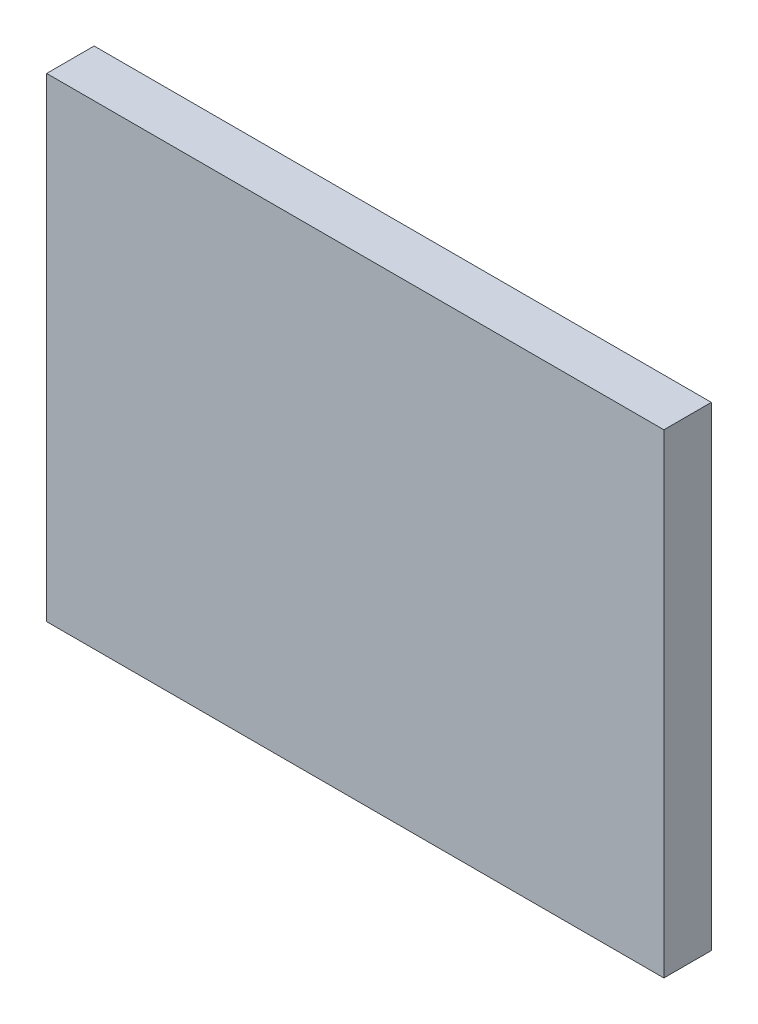
ISO-10303-21;
HEADER;
FILE_DESCRIPTION(('STEP AP214'),'2;1');
FILE_NAME('part.step','',(''),(''),'','','');
FILE_SCHEMA(('AUTOMOTIVE_DESIGN { 1 0 10303 214 1 1 1 1 }'));
ENDSEC;
DATA;
#1=APPLICATION_CONTEXT('core data for automotive mechanical design processes');
#2=APPLICATION_PROTOCOL_DEFINITION('international standard','automotive_design',2000,#1);
#3=PRODUCT_CONTEXT('',#1,'mechanical');
#4=PRODUCT('Part','Part','',(#3));
#5=PRODUCT_RELATED_PRODUCT_CATEGORY('part','',(#4));
#6=PRODUCT_DEFINITION_FORMATION('','',#4);
#7=PRODUCT_DEFINITION_CONTEXT('part definition',#1,'design');
#8=PRODUCT_DEFINITION('design','',#6,#7);
#9=PRODUCT_DEFINITION_SHAPE('','',#8);
#10=(LENGTH_UNIT() NAMED_UNIT(*) SI_UNIT(.MILLI.,.METRE.));
#11=(NAMED_UNIT(*) PLANE_ANGLE_UNIT() SI_UNIT($,.RADIAN.));
#12=(NAMED_UNIT(*) SI_UNIT($,.STERADIAN.) SOLID_ANGLE_UNIT());
#13=UNCERTAINTY_MEASURE_WITH_UNIT(LENGTH_MEASURE(1.E-05),#10,'distance_accuracy_value','');
#14=(GEOMETRIC_REPRESENTATION_CONTEXT(3) GLOBAL_UNCERTAINTY_ASSIGNED_CONTEXT((#13)) GLOBAL_UNIT_ASSIGNED_CONTEXT((#10,
#11,#12)) REPRESENTATION_CONTEXT('',''));
#15=CARTESIAN_POINT('',(0.,0.,0.));
#16=DIRECTION('',(0.,0.,1.));
#17=DIRECTION('',(1.,0.,0.));
#18=AXIS2_PLACEMENT_3D('',#15,#16,#17);
#19=CARTESIAN_POINT('',(-88.4513343349985,100.,10.));
#20=DIRECTION('',(1.,0.,0.));
#21=DIRECTION('',(0.,0.,-1.));
#22=AXIS2_PLACEMENT_3D('',#19,#20,#21);
#23=PLANE('',#22);
#24=DIRECTION('',(0.,-1.,0.));
#25=VECTOR('',#24,1.);
#26=CARTESIAN_POINT('',(-88.4513343349985,100.,0.));
#27=LINE('',#26,#25);
#28=CARTESIAN_POINT('',(-88.4513343349985,100.,0.));
#29=VERTEX_POINT('',#28);
#30=CARTESIAN_POINT('',(-88.4513343349985,0.,0.));
#31=VERTEX_POINT('',#30);
#32=EDGE_CURVE('E96',#29,#31,#27,.T.);
#33=ORIENTED_EDGE('',*,*,#32,.T.);
#34=DIRECTION('',(0.,0.,-1.));
#35=VECTOR('',#34,1.);
#36=CARTESIAN_POINT('',(-88.4513343349985,0.,10.));
#37=LINE('',#36,#35);
#38=CARTESIAN_POINT('',(-88.4513343349985,0.,10.));
#39=VERTEX_POINT('',#38);
#40=EDGE_CURVE('E11',#39,#31,#37,.T.);
#41=ORIENTED_EDGE('',*,*,#40,.F.);
#42=DIRECTION('',(0.,-1.,0.));
#43=VECTOR('',#42,1.);
#44=CARTESIAN_POINT('',(-88.4513343349985,100.,10.));
#45=LINE('',#44,#43);
#46=CARTESIAN_POINT('',(-88.4513343349985,100.,10.));
#47=VERTEX_POINT('',#46);
#48=EDGE_CURVE('E84',#47,#39,#45,.T.);
#49=ORIENTED_EDGE('',*,*,#48,.F.);
#50=DIRECTION('',(0.,0.,-1.));
#51=VECTOR('',#50,1.);
#52=CARTESIAN_POINT('',(-88.4513343349985,100.,10.));
#53=LINE('',#52,#51);
#54=EDGE_CURVE('E92',#47,#29,#53,.T.);
#55=ORIENTED_EDGE('',*,*,#54,.T.);
#56=EDGE_LOOP('',(#33,#41,#49,#55));
#57=FACE_BOUND('',#56,.T.);
#58=ADVANCED_FACE('F33',(#57),#23,.F.);
#59=CARTESIAN_POINT('',(-88.4513343349985,0.,10.));
#60=DIRECTION('',(0.,1.,0.));
#61=DIRECTION('',(0.,0.,1.));
#62=AXIS2_PLACEMENT_3D('',#59,#60,#61);
#63=PLANE('',#62);
#64=DIRECTION('',(1.,0.,0.));
#65=VECTOR('',#64,1.);
#66=CARTESIAN_POINT('',(-88.4513343349985,0.,0.));
#67=LINE('',#66,#65);
#68=CARTESIAN_POINT('',(41.5486656650015,0.,0.));
#69=VERTEX_POINT('',#68);
#70=EDGE_CURVE('E88',#31,#69,#67,.T.);
#71=ORIENTED_EDGE('',*,*,#70,.T.);
#72=DIRECTION('',(0.,0.,-1.));
#73=VECTOR('',#72,1.);
#74=CARTESIAN_POINT('',(41.5486656650015,0.,10.));
#75=LINE('',#74,#73);
#76=CARTESIAN_POINT('',(41.5486656650015,0.,10.));
#77=VERTEX_POINT('',#76);
#78=EDGE_CURVE('E41',#77,#69,#75,.T.);
#79=ORIENTED_EDGE('',*,*,#78,.F.);
#80=DIRECTION('',(1.,0.,0.));
#81=VECTOR('',#80,1.);
#82=CARTESIAN_POINT('',(-88.4513343349985,0.,10.));
#83=LINE('',#82,#81);
#84=EDGE_CURVE('E79',#39,#77,#83,.T.);
#85=ORIENTED_EDGE('',*,*,#84,.F.);
#86=ORIENTED_EDGE('',*,*,#40,.T.);
#87=EDGE_LOOP('',(#71,#79,#85,#86));
#88=FACE_BOUND('',#87,.T.);
#89=ADVANCED_FACE('F87',(#88),#63,.F.);
#90=CARTESIAN_POINT('',(41.5486656650015,0.,10.));
#91=DIRECTION('',(-1.,0.,0.));
#92=DIRECTION('',(0.,-1.,0.));
#93=AXIS2_PLACEMENT_3D('',#90,#91,#92);
#94=PLANE('',#93);
#95=DIRECTION('',(0.,1.,0.));
#96=VECTOR('',#95,1.);
#97=CARTESIAN_POINT('',(41.5486656650015,0.,0.));
#98=LINE('',#97,#96);
#99=CARTESIAN_POINT('',(41.5486656650015,100.,0.));
#100=VERTEX_POINT('',#99);
#101=EDGE_CURVE('E66',#69,#100,#98,.T.);
#102=ORIENTED_EDGE('',*,*,#101,.T.);
#103=DIRECTION('',(0.,0.,-1.));
#104=VECTOR('',#103,1.);
#105=CARTESIAN_POINT('',(41.5486656650015,100.,10.));
#106=LINE('',#105,#104);
#107=CARTESIAN_POINT('',(41.5486656650015,100.,10.));
#108=VERTEX_POINT('',#107);
#109=EDGE_CURVE('E89',#108,#100,#106,.T.);
#110=ORIENTED_EDGE('',*,*,#109,.F.);
#111=DIRECTION('',(0.,1.,0.));
#112=VECTOR('',#111,1.);
#113=CARTESIAN_POINT('',(41.5486656650015,0.,10.));
#114=LINE('',#113,#112);
#115=EDGE_CURVE('E82',#77,#108,#114,.T.);
#116=ORIENTED_EDGE('',*,*,#115,.F.);
#117=ORIENTED_EDGE('',*,*,#78,.T.);
#118=EDGE_LOOP('',(#102,#110,#116,#117));
#119=FACE_BOUND('',#118,.T.);
#120=ADVANCED_FACE('F90',(#119),#94,.F.);
#121=CARTESIAN_POINT('',(41.5486656650015,100.,10.));
#122=DIRECTION('',(0.,-1.,0.));
#123=DIRECTION('',(1.,0.,0.));
#124=AXIS2_PLACEMENT_3D('',#121,#122,#123);
#125=PLANE('',#124);
#126=DIRECTION('',(-1.,0.,0.));
#127=VECTOR('',#126,1.);
#128=CARTESIAN_POINT('',(41.5486656650015,100.,0.));
#129=LINE('',#128,#127);
#130=EDGE_CURVE('E72',#100,#29,#129,.T.);
#131=ORIENTED_EDGE('',*,*,#130,.T.);
#132=ORIENTED_EDGE('',*,*,#54,.F.);
#133=DIRECTION('',(-1.,0.,0.));
#134=VECTOR('',#133,1.);
#135=CARTESIAN_POINT('',(41.5486656650015,100.,10.));
#136=LINE('',#135,#134);
#137=EDGE_CURVE('E49',#108,#47,#136,.T.);
#138=ORIENTED_EDGE('',*,*,#137,.F.);
#139=ORIENTED_EDGE('',*,*,#109,.T.);
#140=EDGE_LOOP('',(#131,#132,#138,#139));
#141=FACE_BOUND('',#140,.T.);
#142=ADVANCED_FACE('F103',(#141),#125,.F.);
#143=CARTESIAN_POINT('',(0.,0.,10.));
#144=DIRECTION('',(0.,0.,1.));
#145=DIRECTION('',(1.,0.,0.));
#146=AXIS2_PLACEMENT_3D('',#143,#144,#145);
#147=PLANE('',#146);
#148=ORIENTED_EDGE('',*,*,#48,.T.);
#149=ORIENTED_EDGE('',*,*,#84,.T.);
#150=ORIENTED_EDGE('',*,*,#115,.T.);
#151=ORIENTED_EDGE('',*,*,#137,.T.);
#152=EDGE_LOOP('',(#148,#149,#150,#151));
#153=FACE_BOUND('',#152,.T.);
#154=ADVANCED_FACE('F80',(#153),#147,.T.);
#155=CARTESIAN_POINT('',(0.,0.,0.));
#156=DIRECTION('',(0.,0.,1.));
#157=DIRECTION('',(1.,0.,0.));
#158=AXIS2_PLACEMENT_3D('',#155,#156,#157);
#159=PLANE('',#158);
#160=ORIENTED_EDGE('',*,*,#32,.F.);
#161=ORIENTED_EDGE('',*,*,#130,.F.);
#162=ORIENTED_EDGE('',*,*,#101,.F.);
#163=ORIENTED_EDGE('',*,*,#70,.F.);
#164=EDGE_LOOP('',(#160,#161,#162,#163));
#165=FACE_BOUND('',#164,.T.);
#166=ADVANCED_FACE('F106',(#165),#159,.F.);
#167=CLOSED_SHELL('',(#58,#89,#120,#142,#154,#166));
#168=MANIFOLD_SOLID_BREP('B2',#167);
#169=ADVANCED_BREP_SHAPE_REPRESENTATION('',(#18,#168),#14);
#170=SHAPE_DEFINITION_REPRESENTATION(#9,#169);
ENDSEC;
END-ISO-10303-21;
